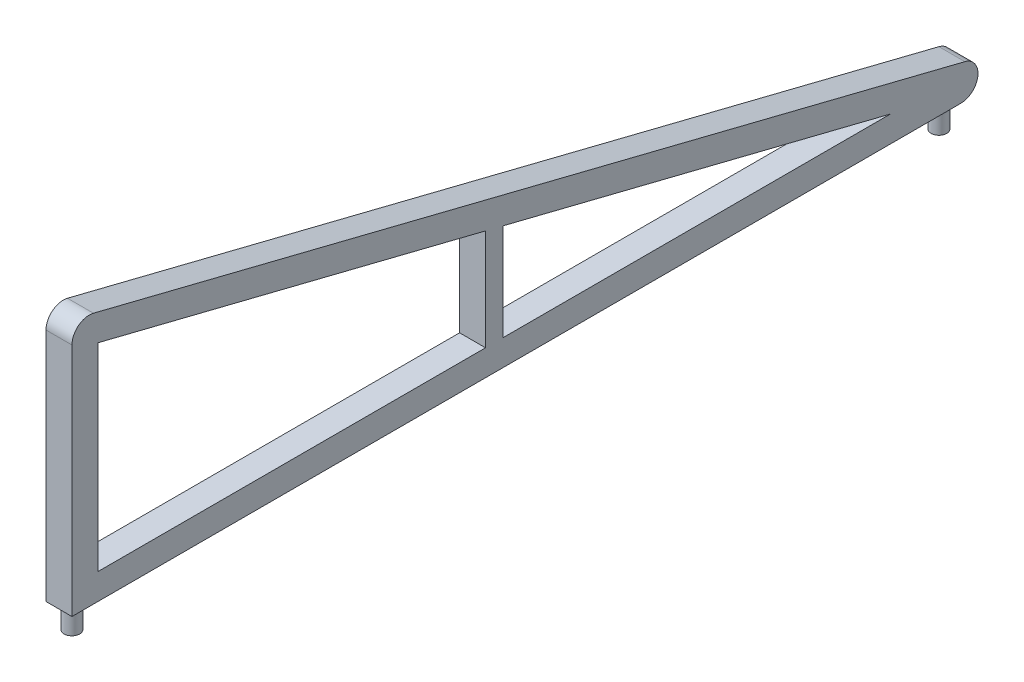
ISO-10303-21;
HEADER;
FILE_DESCRIPTION(('STEP AP214'),'2;1');
FILE_NAME('part.step','',(''),(''),'','','');
FILE_SCHEMA(('AUTOMOTIVE_DESIGN { 1 0 10303 214 1 1 1 1 }'));
ENDSEC;
DATA;
#1=APPLICATION_CONTEXT('core data for automotive mechanical design processes');
#2=APPLICATION_PROTOCOL_DEFINITION('international standard','automotive_design',2000,#1);
#3=PRODUCT_CONTEXT('',#1,'mechanical');
#4=PRODUCT('Part','Part','',(#3));
#5=PRODUCT_RELATED_PRODUCT_CATEGORY('part','',(#4));
#6=PRODUCT_DEFINITION_FORMATION('','',#4);
#7=PRODUCT_DEFINITION_CONTEXT('part definition',#1,'design');
#8=PRODUCT_DEFINITION('design','',#6,#7);
#9=PRODUCT_DEFINITION_SHAPE('','',#8);
#10=(LENGTH_UNIT() NAMED_UNIT(*) SI_UNIT(.MILLI.,.METRE.));
#11=(NAMED_UNIT(*) PLANE_ANGLE_UNIT() SI_UNIT($,.RADIAN.));
#12=(NAMED_UNIT(*) SI_UNIT($,.STERADIAN.) SOLID_ANGLE_UNIT());
#13=UNCERTAINTY_MEASURE_WITH_UNIT(LENGTH_MEASURE(1.E-05),#10,'distance_accuracy_value','');
#14=(GEOMETRIC_REPRESENTATION_CONTEXT(3) GLOBAL_UNCERTAINTY_ASSIGNED_CONTEXT((#13)) GLOBAL_UNIT_ASSIGNED_CONTEXT((#10,
#11,#12)) REPRESENTATION_CONTEXT('',''));
#15=CARTESIAN_POINT('',(0.,0.,0.));
#16=DIRECTION('',(0.,0.,1.));
#17=DIRECTION('',(1.,0.,0.));
#18=AXIS2_PLACEMENT_3D('',#15,#16,#17);
#19=CARTESIAN_POINT('',(1.5,25.3248666172111,-6.33121665430276));
#20=DIRECTION('',(0.,0.970142500145332,-0.242535625036333));
#21=DIRECTION('',(0.,0.242535625036333,0.970142500145332));
#22=AXIS2_PLACEMENT_3D('',#19,#20,#21);
#23=PLANE('',#22);
#24=DIRECTION('',(-1.,0.,0.));
#25=VECTOR('',#24,1.);
#26=CARTESIAN_POINT('',(13.3734899185296,14.2038353903934,-50.8153415615735));
#27=LINE('',#26,#25);
#28=CARTESIAN_POINT('',(1.5,14.2038353903934,-50.8153415615735));
#29=VERTEX_POINT('',#28);
#30=CARTESIAN_POINT('',(-1.5,14.2038353903934,-50.8153415615735));
#31=VERTEX_POINT('',#30);
#32=EDGE_CURVE('E243',#29,#31,#27,.T.);
#33=ORIENTED_EDGE('',*,*,#32,.T.);
#34=DIRECTION('',(0.,-0.242535625036333,-0.970142500145332));
#35=VECTOR('',#34,1.);
#36=CARTESIAN_POINT('',(-1.5,25.3248666172111,-6.33121665430276));
#37=LINE('',#36,#35);
#38=CARTESIAN_POINT('',(-1.5,3.,-95.630683123147));
#39=VERTEX_POINT('',#38);
#40=EDGE_CURVE('E219',#31,#39,#37,.T.);
#41=ORIENTED_EDGE('',*,*,#40,.T.);
#42=DIRECTION('',(-1.,0.,0.));
#43=VECTOR('',#42,1.);
#44=CARTESIAN_POINT('',(1.5,3.,-95.630683123147));
#45=LINE('',#44,#43);
#46=CARTESIAN_POINT('',(1.5,3.,-95.630683123147));
#47=VERTEX_POINT('',#46);
#48=EDGE_CURVE('E160',#47,#39,#45,.T.);
#49=ORIENTED_EDGE('',*,*,#48,.F.);
#50=DIRECTION('',(0.,-0.242535625036333,-0.970142500145332));
#51=VECTOR('',#50,1.);
#52=CARTESIAN_POINT('',(1.5,25.3248666172111,-6.33121665430276));
#53=LINE('',#52,#51);
#54=EDGE_CURVE('E55',#29,#47,#53,.T.);
#55=ORIENTED_EDGE('',*,*,#54,.F.);
#56=EDGE_LOOP('',(#33,#41,#49,#55));
#57=FACE_BOUND('',#56,.T.);
#58=ADVANCED_FACE('F40',(#57),#23,.F.);
#59=CARTESIAN_POINT('',(1.5,3.,0.));
#60=DIRECTION('',(0.,1.,0.));
#61=DIRECTION('',(0.,0.,1.));
#62=AXIS2_PLACEMENT_3D('',#59,#60,#61);
#63=PLANE('',#62);
#64=DIRECTION('',(0.,0.,-1.));
#65=VECTOR('',#64,1.);
#66=CARTESIAN_POINT('',(-1.5,3.,0.));
#67=LINE('',#66,#65);
#68=CARTESIAN_POINT('',(-1.5,3.,-50.8153415615735));
#69=VERTEX_POINT('',#68);
#70=EDGE_CURVE('E222',#69,#39,#67,.T.);
#71=ORIENTED_EDGE('',*,*,#70,.F.);
#72=DIRECTION('',(-1.,0.,0.));
#73=VECTOR('',#72,1.);
#74=CARTESIAN_POINT('',(13.3734899185296,3.,-50.8153415615735));
#75=LINE('',#74,#73);
#76=CARTESIAN_POINT('',(1.5,3.,-50.8153415615735));
#77=VERTEX_POINT('',#76);
#78=EDGE_CURVE('E239',#77,#69,#75,.T.);
#79=ORIENTED_EDGE('',*,*,#78,.F.);
#80=DIRECTION('',(0.,0.,-1.));
#81=VECTOR('',#80,1.);
#82=CARTESIAN_POINT('',(1.5,3.,0.));
#83=LINE('',#82,#81);
#84=EDGE_CURVE('E153',#77,#47,#83,.T.);
#85=ORIENTED_EDGE('',*,*,#84,.T.);
#86=ORIENTED_EDGE('',*,*,#48,.T.);
#87=EDGE_LOOP('',(#71,#79,#85,#86));
#88=FACE_BOUND('',#87,.T.);
#89=ADVANCED_FACE('F236',(#88),#63,.T.);
#90=CARTESIAN_POINT('',(1.5,0.,-4.));
#91=DIRECTION('',(0.,0.,1.));
#92=DIRECTION('',(1.,0.,0.));
#93=AXIS2_PLACEMENT_3D('',#90,#91,#92);
#94=PLANE('',#93);
#95=DIRECTION('',(-1.,0.,0.));
#96=VECTOR('',#95,1.);
#97=CARTESIAN_POINT('',(1.5,3.,-4.));
#98=LINE('',#97,#96);
#99=CARTESIAN_POINT('',(1.5,3.,-4.));
#100=VERTEX_POINT('',#99);
#101=CARTESIAN_POINT('',(-1.5,3.,-4.));
#102=VERTEX_POINT('',#101);
#103=EDGE_CURVE('E150',#100,#102,#98,.T.);
#104=ORIENTED_EDGE('',*,*,#103,.T.);
#105=DIRECTION('',(0.,1.,0.));
#106=VECTOR('',#105,1.);
#107=CARTESIAN_POINT('',(-1.5,0.,-4.));
#108=LINE('',#107,#106);
#109=CARTESIAN_POINT('',(-1.5,25.9076707807868,-4.));
#110=VERTEX_POINT('',#109);
#111=EDGE_CURVE('E216',#102,#110,#108,.T.);
#112=ORIENTED_EDGE('',*,*,#111,.T.);
#113=DIRECTION('',(-1.,0.,0.));
#114=VECTOR('',#113,1.);
#115=CARTESIAN_POINT('',(1.5,25.9076707807868,-4.));
#116=LINE('',#115,#114);
#117=CARTESIAN_POINT('',(1.5,25.9076707807868,-4.));
#118=VERTEX_POINT('',#117);
#119=EDGE_CURVE('E163',#118,#110,#116,.T.);
#120=ORIENTED_EDGE('',*,*,#119,.F.);
#121=DIRECTION('',(0.,1.,0.));
#122=VECTOR('',#121,1.);
#123=CARTESIAN_POINT('',(1.5,0.,-4.));
#124=LINE('',#123,#122);
#125=EDGE_CURVE('E228',#100,#118,#124,.T.);
#126=ORIENTED_EDGE('',*,*,#125,.F.);
#127=EDGE_LOOP('',(#104,#112,#120,#126));
#128=FACE_BOUND('',#127,.T.);
#129=ADVANCED_FACE('F281',(#128),#94,.F.);
#130=CARTESIAN_POINT('',(-1.5,14.7038353903934,-48.8153415615735));
#131=VERTEX_POINT('',#130);
#132=EDGE_CURVE('E220',#110,#131,#37,.T.);
#133=ORIENTED_EDGE('',*,*,#132,.T.);
#134=DIRECTION('',(-1.,0.,0.));
#135=VECTOR('',#134,1.);
#136=CARTESIAN_POINT('',(13.3734899185296,14.7038353903934,-48.8153415615735));
#137=LINE('',#136,#135);
#138=CARTESIAN_POINT('',(1.5,14.7038353903934,-48.8153415615735));
#139=VERTEX_POINT('',#138);
#140=EDGE_CURVE('E63',#139,#131,#137,.T.);
#141=ORIENTED_EDGE('',*,*,#140,.F.);
#142=EDGE_CURVE('E137',#118,#139,#53,.T.);
#143=ORIENTED_EDGE('',*,*,#142,.F.);
#144=ORIENTED_EDGE('',*,*,#119,.T.);
#145=EDGE_LOOP('',(#133,#141,#143,#144));
#146=FACE_BOUND('',#145,.T.);
#147=ADVANCED_FACE('F277',(#146),#23,.F.);
#148=CARTESIAN_POINT('',(1.5,28.2352941176471,-7.05882352941176));
#149=DIRECTION('',(0.,0.970142500145332,-0.242535625036333));
#150=DIRECTION('',(0.,0.242535625036333,0.970142500145332));
#151=AXIS2_PLACEMENT_3D('',#148,#149,#150);
#152=PLANE('',#151);
#153=DIRECTION('',(0.,-0.242535625036333,-0.970142500145332));
#154=VECTOR('',#153,1.);
#155=CARTESIAN_POINT('',(1.5,28.2352941176471,-7.05882352941176));
#156=LINE('',#155,#154);
#157=CARTESIAN_POINT('',(1.5,29.1287321874818,-3.48507125007267));
#158=VERTEX_POINT('',#157);
#159=CARTESIAN_POINT('',(1.5,3.94028500029067,-104.238859998837));
#160=VERTEX_POINT('',#159);
#161=EDGE_CURVE('E177',#158,#160,#156,.T.);
#162=ORIENTED_EDGE('',*,*,#161,.T.);
#163=DIRECTION('',(-1.,0.,0.));
#164=VECTOR('',#163,1.);
#165=CARTESIAN_POINT('',(0.,3.94028500029066,-104.238859998837));
#166=LINE('',#165,#164);
#167=CARTESIAN_POINT('',(-1.5,3.94028500029067,-104.238859998837));
#168=VERTEX_POINT('',#167);
#169=EDGE_CURVE('E167',#160,#168,#166,.T.);
#170=ORIENTED_EDGE('',*,*,#169,.T.);
#171=DIRECTION('',(0.,-0.242535625036333,-0.970142500145332));
#172=VECTOR('',#171,1.);
#173=CARTESIAN_POINT('',(-1.5,28.2352941176471,-7.05882352941176));
#174=LINE('',#173,#172);
#175=CARTESIAN_POINT('',(-1.5,29.1287321874818,-3.48507125007267));
#176=VERTEX_POINT('',#175);
#177=EDGE_CURVE('E200',#176,#168,#174,.T.);
#178=ORIENTED_EDGE('',*,*,#177,.F.);
#179=DIRECTION('',(-1.,0.,0.));
#180=VECTOR('',#179,1.);
#181=CARTESIAN_POINT('',(1.5,29.1287321874818,-3.48507125007267));
#182=LINE('',#181,#180);
#183=EDGE_CURVE('E164',#176,#158,#182,.F.);
#184=ORIENTED_EDGE('',*,*,#183,.T.);
#185=EDGE_LOOP('',(#162,#170,#178,#184));
#186=FACE_BOUND('',#185,.T.);
#187=ADVANCED_FACE('F185',(#186),#152,.T.);
#188=CARTESIAN_POINT('',(1.5,0.,-1.));
#189=DIRECTION('',(0.,0.,1.));
#190=DIRECTION('',(1.,0.,0.));
#191=AXIS2_PLACEMENT_3D('',#188,#189,#190);
#192=PLANE('',#191);
#193=DIRECTION('',(0.,1.,0.));
#194=VECTOR('',#193,1.);
#195=CARTESIAN_POINT('',(1.5,0.,-1.));
#196=LINE('',#195,#194);
#197=CARTESIAN_POINT('',(1.5,0.,-1.));
#198=VERTEX_POINT('',#197);
#199=CARTESIAN_POINT('',(1.5,27.1884471871912,-1.));
#200=VERTEX_POINT('',#199);
#201=EDGE_CURVE('E188',#198,#200,#196,.T.);
#202=ORIENTED_EDGE('',*,*,#201,.T.);
#203=DIRECTION('',(-1.,0.,0.));
#204=VECTOR('',#203,1.);
#205=CARTESIAN_POINT('',(1.5,27.1884471871912,-1.));
#206=LINE('',#205,#204);
#207=CARTESIAN_POINT('',(-1.5,27.1884471871912,-1.));
#208=VERTEX_POINT('',#207);
#209=EDGE_CURVE('E12',#200,#208,#206,.T.);
#210=ORIENTED_EDGE('',*,*,#209,.T.);
#211=DIRECTION('',(0.,1.,0.));
#212=VECTOR('',#211,1.);
#213=CARTESIAN_POINT('',(-1.5,0.,-1.));
#214=LINE('',#213,#212);
#215=CARTESIAN_POINT('',(-1.5,0.,-1.));
#216=VERTEX_POINT('',#215);
#217=EDGE_CURVE('E205',#216,#208,#214,.T.);
#218=ORIENTED_EDGE('',*,*,#217,.F.);
#219=DIRECTION('',(-1.,0.,0.));
#220=VECTOR('',#219,1.);
#221=CARTESIAN_POINT('',(1.5,0.,-1.));
#222=LINE('',#221,#220);
#223=EDGE_CURVE('E152',#198,#216,#222,.T.);
#224=ORIENTED_EDGE('',*,*,#223,.F.);
#225=EDGE_LOOP('',(#202,#210,#218,#224));
#226=FACE_BOUND('',#225,.T.);
#227=ADVANCED_FACE('F263',(#226),#192,.T.);
#228=CARTESIAN_POINT('',(1.5,0.,0.));
#229=DIRECTION('',(0.,1.,0.));
#230=DIRECTION('',(0.,0.,1.));
#231=AXIS2_PLACEMENT_3D('',#228,#229,#230);
#232=PLANE('',#231);
#233=ORIENTED_EDGE('',*,*,#223,.T.);
#234=DIRECTION('',(0.,0.,-1.));
#235=VECTOR('',#234,1.);
#236=CARTESIAN_POINT('',(-1.5,0.,0.));
#237=LINE('',#236,#235);
#238=CARTESIAN_POINT('',(-1.5,0.,-103.753788748765));
#239=VERTEX_POINT('',#238);
#240=EDGE_CURVE('E208',#216,#239,#237,.T.);
#241=ORIENTED_EDGE('',*,*,#240,.T.);
#242=DIRECTION('',(-1.,0.,0.));
#243=VECTOR('',#242,1.);
#244=CARTESIAN_POINT('',(1.5,0.,-103.753788748765));
#245=LINE('',#244,#243);
#246=CARTESIAN_POINT('',(1.5,0.,-103.753788748765));
#247=VERTEX_POINT('',#246);
#248=EDGE_CURVE('E169',#239,#247,#245,.F.);
#249=ORIENTED_EDGE('',*,*,#248,.T.);
#250=DIRECTION('',(0.,0.,-1.));
#251=VECTOR('',#250,1.);
#252=CARTESIAN_POINT('',(1.5,0.,0.));
#253=LINE('',#252,#251);
#254=EDGE_CURVE('E181',#198,#247,#253,.T.);
#255=ORIENTED_EDGE('',*,*,#254,.F.);
#256=EDGE_LOOP('',(#233,#241,#249,#255));
#257=FACE_BOUND('',#256,.T.);
#258=CARTESIAN_POINT('',(0.,0.,-102.738859998837));
#259=DIRECTION('',(0.,1.,0.));
#260=DIRECTION('',(0.,0.,1.));
#261=AXIS2_PLACEMENT_3D('',#258,#259,#260);
#262=CIRCLE('',#261,0.9);
#263=CARTESIAN_POINT('',(0.,0.,-101.838859998837));
#264=VERTEX_POINT('',#263);
#265=EDGE_CURVE('E206',#264,#264,#262,.F.);
#266=ORIENTED_EDGE('',*,*,#265,.F.);
#267=EDGE_LOOP('',(#266));
#268=FACE_BOUND('',#267,.T.);
#269=CARTESIAN_POINT('',(0.,0.,-2.5));
#270=DIRECTION('',(0.,1.,0.));
#271=DIRECTION('',(0.,0.,1.));
#272=AXIS2_PLACEMENT_3D('',#269,#270,#271);
#273=CIRCLE('',#272,0.9);
#274=CARTESIAN_POINT('',(0.,0.,-1.6));
#275=VERTEX_POINT('',#274);
#276=EDGE_CURVE('E211',#275,#275,#273,.F.);
#277=ORIENTED_EDGE('',*,*,#276,.F.);
#278=EDGE_LOOP('',(#277));
#279=FACE_BOUND('',#278,.T.);
#280=ADVANCED_FACE('F261',(#257,#268,#279),#232,.F.);
#281=DIRECTION('',(-1.,0.,0.));
#282=VECTOR('',#281,1.);
#283=CARTESIAN_POINT('',(13.3734899185296,3.,-48.8153415615735));
#284=LINE('',#283,#282);
#285=CARTESIAN_POINT('',(1.5,3.,-48.8153415615735));
#286=VERTEX_POINT('',#285);
#287=CARTESIAN_POINT('',(-1.5,3.,-48.8153415615735));
#288=VERTEX_POINT('',#287);
#289=EDGE_CURVE('E139',#286,#288,#284,.T.);
#290=ORIENTED_EDGE('',*,*,#289,.T.);
#291=EDGE_CURVE('E223',#102,#288,#67,.T.);
#292=ORIENTED_EDGE('',*,*,#291,.F.);
#293=ORIENTED_EDGE('',*,*,#103,.F.);
#294=EDGE_CURVE('E136',#100,#286,#83,.T.);
#295=ORIENTED_EDGE('',*,*,#294,.T.);
#296=EDGE_LOOP('',(#290,#292,#293,#295));
#297=FACE_BOUND('',#296,.T.);
#298=ADVANCED_FACE('F149',(#297),#63,.T.);
#299=CARTESIAN_POINT('',(1.5,0.,0.));
#300=DIRECTION('',(1.,0.,0.));
#301=DIRECTION('',(0.,0.,-1.));
#302=AXIS2_PLACEMENT_3D('',#299,#300,#301);
#303=PLANE('',#302);
#304=DIRECTION('',(0.,1.,0.));
#305=VECTOR('',#304,1.);
#306=CARTESIAN_POINT('',(1.5,0.,-48.8153415615735));
#307=LINE('',#306,#305);
#308=EDGE_CURVE('E130',#286,#139,#307,.T.);
#309=ORIENTED_EDGE('',*,*,#308,.F.);
#310=ORIENTED_EDGE('',*,*,#294,.F.);
#311=ORIENTED_EDGE('',*,*,#125,.T.);
#312=ORIENTED_EDGE('',*,*,#142,.T.);
#313=EDGE_LOOP('',(#309,#310,#311,#312));
#314=FACE_BOUND('',#313,.T.);
#315=ORIENTED_EDGE('',*,*,#254,.T.);
#316=CARTESIAN_POINT('',(1.5,2.,-103.753788748765));
#317=DIRECTION('',(1.,0.,0.));
#318=DIRECTION('',(0.,0.,-1.));
#319=AXIS2_PLACEMENT_3D('',#316,#317,#318);
#320=CIRCLE('',#319,2.);
#321=EDGE_CURVE('E48',#247,#160,#320,.T.);
#322=ORIENTED_EDGE('',*,*,#321,.T.);
#323=ORIENTED_EDGE('',*,*,#161,.F.);
#324=CARTESIAN_POINT('',(1.5,27.1884471871912,-3.));
#325=DIRECTION('',(1.,0.,0.));
#326=DIRECTION('',(0.,0.,-1.));
#327=AXIS2_PLACEMENT_3D('',#324,#325,#326);
#328=CIRCLE('',#327,2.);
#329=EDGE_CURVE('E171',#158,#200,#328,.T.);
#330=ORIENTED_EDGE('',*,*,#329,.T.);
#331=ORIENTED_EDGE('',*,*,#201,.F.);
#332=EDGE_LOOP('',(#315,#322,#323,#330,#331));
#333=FACE_BOUND('',#332,.T.);
#334=ORIENTED_EDGE('',*,*,#84,.F.);
#335=DIRECTION('',(0.,1.,0.));
#336=VECTOR('',#335,1.);
#337=CARTESIAN_POINT('',(1.5,0.,-50.8153415615735));
#338=LINE('',#337,#336);
#339=EDGE_CURVE('E231',#77,#29,#338,.T.);
#340=ORIENTED_EDGE('',*,*,#339,.T.);
#341=ORIENTED_EDGE('',*,*,#54,.T.);
#342=EDGE_LOOP('',(#334,#340,#341));
#343=FACE_BOUND('',#342,.T.);
#344=ADVANCED_FACE('F132',(#314,#333,#343),#303,.T.);
#345=CARTESIAN_POINT('',(1.5,2.,-103.753788748765));
#346=DIRECTION('',(1.,0.,0.));
#347=DIRECTION('',(0.,0.,-1.));
#348=AXIS2_PLACEMENT_3D('',#345,#346,#347);
#349=CYLINDRICAL_SURFACE('',#348,2.);
#350=ORIENTED_EDGE('',*,*,#321,.F.);
#351=ORIENTED_EDGE('',*,*,#248,.F.);
#352=CARTESIAN_POINT('',(-1.5,2.,-103.753788748765));
#353=DIRECTION('',(1.,0.,0.));
#354=DIRECTION('',(0.,0.,-1.));
#355=AXIS2_PLACEMENT_3D('',#352,#353,#354);
#356=CIRCLE('',#355,2.);
#357=EDGE_CURVE('E189',#239,#168,#356,.T.);
#358=ORIENTED_EDGE('',*,*,#357,.T.);
#359=ORIENTED_EDGE('',*,*,#169,.F.);
#360=EDGE_LOOP('',(#350,#351,#358,#359));
#361=FACE_BOUND('',#360,.T.);
#362=ADVANCED_FACE('F191',(#361),#349,.T.);
#363=CARTESIAN_POINT('',(1.5,27.1884471871912,-3.));
#364=DIRECTION('',(-1.,0.,0.));
#365=DIRECTION('',(0.,0.,1.));
#366=AXIS2_PLACEMENT_3D('',#363,#364,#365);
#367=CYLINDRICAL_SURFACE('',#366,2.);
#368=ORIENTED_EDGE('',*,*,#329,.F.);
#369=ORIENTED_EDGE('',*,*,#183,.F.);
#370=CARTESIAN_POINT('',(-1.5,27.1884471871912,-3.));
#371=DIRECTION('',(1.,0.,0.));
#372=DIRECTION('',(0.,0.,-1.));
#373=AXIS2_PLACEMENT_3D('',#370,#371,#372);
#374=CIRCLE('',#373,2.);
#375=EDGE_CURVE('E197',#176,#208,#374,.T.);
#376=ORIENTED_EDGE('',*,*,#375,.T.);
#377=ORIENTED_EDGE('',*,*,#209,.F.);
#378=EDGE_LOOP('',(#368,#369,#376,#377));
#379=FACE_BOUND('',#378,.T.);
#380=ADVANCED_FACE('F42',(#379),#367,.T.);
#381=CARTESIAN_POINT('',(-1.5,0.,0.));
#382=DIRECTION('',(-1.,0.,0.));
#383=DIRECTION('',(0.,0.,-1.));
#384=AXIS2_PLACEMENT_3D('',#381,#382,#383);
#385=PLANE('',#384);
#386=ORIENTED_EDGE('',*,*,#291,.T.);
#387=DIRECTION('',(0.,1.,0.));
#388=VECTOR('',#387,1.);
#389=CARTESIAN_POINT('',(-1.5,0.,-48.8153415615735));
#390=LINE('',#389,#388);
#391=EDGE_CURVE('E144',#288,#131,#390,.T.);
#392=ORIENTED_EDGE('',*,*,#391,.T.);
#393=ORIENTED_EDGE('',*,*,#132,.F.);
#394=ORIENTED_EDGE('',*,*,#111,.F.);
#395=EDGE_LOOP('',(#386,#392,#393,#394));
#396=FACE_BOUND('',#395,.T.);
#397=ORIENTED_EDGE('',*,*,#240,.F.);
#398=ORIENTED_EDGE('',*,*,#217,.T.);
#399=ORIENTED_EDGE('',*,*,#375,.F.);
#400=ORIENTED_EDGE('',*,*,#177,.T.);
#401=ORIENTED_EDGE('',*,*,#357,.F.);
#402=EDGE_LOOP('',(#397,#398,#399,#400,#401));
#403=FACE_BOUND('',#402,.T.);
#404=DIRECTION('',(0.,1.,0.));
#405=VECTOR('',#404,1.);
#406=CARTESIAN_POINT('',(-1.5,0.,-50.8153415615735));
#407=LINE('',#406,#405);
#408=EDGE_CURVE('E242',#69,#31,#407,.T.);
#409=ORIENTED_EDGE('',*,*,#408,.F.);
#410=ORIENTED_EDGE('',*,*,#70,.T.);
#411=ORIENTED_EDGE('',*,*,#40,.F.);
#412=EDGE_LOOP('',(#409,#410,#411));
#413=FACE_BOUND('',#412,.T.);
#414=ADVANCED_FACE('F201',(#396,#403,#413),#385,.T.);
#415=CARTESIAN_POINT('',(0.,105.846732202704,-102.738859998837));
#416=DIRECTION('',(0.,-1.,0.));
#417=DIRECTION('',(0.,0.,-1.));
#418=AXIS2_PLACEMENT_3D('',#415,#416,#417);
#419=CYLINDRICAL_SURFACE('',#418,0.9);
#420=CARTESIAN_POINT('',(0.,-2.8,-102.738859998837));
#421=DIRECTION('',(0.,-1.,0.));
#422=DIRECTION('',(0.,0.,-1.));
#423=AXIS2_PLACEMENT_3D('',#420,#421,#422);
#424=CIRCLE('',#423,0.9);
#425=CARTESIAN_POINT('',(0.,-2.8,-103.638859998837));
#426=VERTEX_POINT('',#425);
#427=EDGE_CURVE('E252',#426,#426,#424,.T.);
#428=ORIENTED_EDGE('',*,*,#427,.F.);
#429=EDGE_LOOP('',(#428));
#430=FACE_BOUND('',#429,.T.);
#431=ORIENTED_EDGE('',*,*,#265,.T.);
#432=EDGE_LOOP('',(#431));
#433=FACE_BOUND('',#432,.T.);
#434=ADVANCED_FACE('F295',(#430,#433),#419,.T.);
#435=CARTESIAN_POINT('',(0.,105.846732202704,-2.5));
#436=DIRECTION('',(0.,-1.,0.));
#437=DIRECTION('',(0.,0.,-1.));
#438=AXIS2_PLACEMENT_3D('',#435,#436,#437);
#439=CYLINDRICAL_SURFACE('',#438,0.9);
#440=CARTESIAN_POINT('',(0.,-2.8,-2.5));
#441=DIRECTION('',(0.,-1.,0.));
#442=DIRECTION('',(0.,0.,-1.));
#443=AXIS2_PLACEMENT_3D('',#440,#441,#442);
#444=CIRCLE('',#443,0.9);
#445=CARTESIAN_POINT('',(0.,-2.8,-3.4));
#446=VERTEX_POINT('',#445);
#447=EDGE_CURVE('E245',#446,#446,#444,.T.);
#448=ORIENTED_EDGE('',*,*,#447,.F.);
#449=EDGE_LOOP('',(#448));
#450=FACE_BOUND('',#449,.T.);
#451=ORIENTED_EDGE('',*,*,#276,.T.);
#452=EDGE_LOOP('',(#451));
#453=FACE_BOUND('',#452,.T.);
#454=ADVANCED_FACE('F259',(#450,#453),#439,.T.);
#455=CARTESIAN_POINT('',(0.,-2.8,-102.738859998837));
#456=DIRECTION('',(0.,1.,0.));
#457=DIRECTION('',(0.,0.,1.));
#458=AXIS2_PLACEMENT_3D('',#455,#456,#457);
#459=PLANE('',#458);
#460=ORIENTED_EDGE('',*,*,#427,.T.);
#461=EDGE_LOOP('',(#460));
#462=FACE_BOUND('',#461,.T.);
#463=ADVANCED_FACE('F334',(#462),#459,.F.);
#464=CARTESIAN_POINT('',(0.,-2.8,-2.5));
#465=DIRECTION('',(0.,1.,0.));
#466=DIRECTION('',(0.,0.,1.));
#467=AXIS2_PLACEMENT_3D('',#464,#465,#466);
#468=PLANE('',#467);
#469=ORIENTED_EDGE('',*,*,#447,.T.);
#470=EDGE_LOOP('',(#469));
#471=FACE_BOUND('',#470,.T.);
#472=ADVANCED_FACE('F306',(#471),#468,.F.);
#473=CARTESIAN_POINT('',(13.3734899185296,0.,-48.8153415615735));
#474=DIRECTION('',(0.,0.,1.));
#475=DIRECTION('',(1.,0.,0.));
#476=AXIS2_PLACEMENT_3D('',#473,#474,#475);
#477=PLANE('',#476);
#478=ORIENTED_EDGE('',*,*,#289,.F.);
#479=ORIENTED_EDGE('',*,*,#308,.T.);
#480=ORIENTED_EDGE('',*,*,#140,.T.);
#481=ORIENTED_EDGE('',*,*,#391,.F.);
#482=EDGE_LOOP('',(#478,#479,#480,#481));
#483=FACE_BOUND('',#482,.T.);
#484=ADVANCED_FACE('F142',(#483),#477,.T.);
#485=CARTESIAN_POINT('',(13.3734899185296,0.,-50.8153415615735));
#486=DIRECTION('',(0.,0.,1.));
#487=DIRECTION('',(1.,0.,0.));
#488=AXIS2_PLACEMENT_3D('',#485,#486,#487);
#489=PLANE('',#488);
#490=ORIENTED_EDGE('',*,*,#339,.F.);
#491=ORIENTED_EDGE('',*,*,#78,.T.);
#492=ORIENTED_EDGE('',*,*,#408,.T.);
#493=ORIENTED_EDGE('',*,*,#32,.F.);
#494=EDGE_LOOP('',(#490,#491,#492,#493));
#495=FACE_BOUND('',#494,.T.);
#496=ADVANCED_FACE('F399',(#495),#489,.F.);
#497=CLOSED_SHELL('',(#58,#89,#129,#147,#187,#227,#280,#298,#344,#362,#380,#414,#434,#454,#463,
#472,#484,#496));
#498=MANIFOLD_SOLID_BREP('B2',#497);
#499=ADVANCED_BREP_SHAPE_REPRESENTATION('',(#18,#498),#14);
#500=SHAPE_DEFINITION_REPRESENTATION(#9,#499);
ENDSEC;
END-ISO-10303-21;
